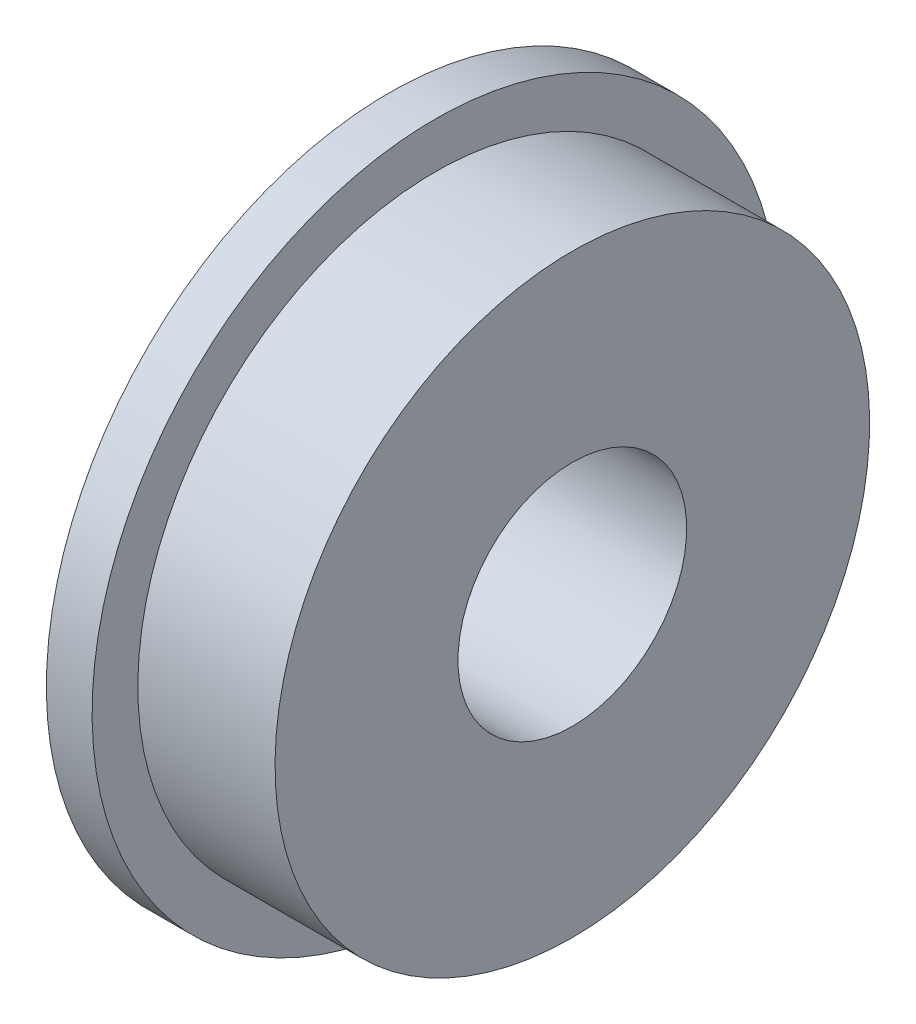
ISO-10303-21;
HEADER;
FILE_DESCRIPTION(('STEP AP214'),'2;1');
FILE_NAME('part.step','',(''),(''),'','','');
FILE_SCHEMA(('AUTOMOTIVE_DESIGN { 1 0 10303 214 1 1 1 1 }'));
ENDSEC;
DATA;
#1=APPLICATION_CONTEXT('core data for automotive mechanical design processes');
#2=APPLICATION_PROTOCOL_DEFINITION('international standard','automotive_design',2000,#1);
#3=PRODUCT_CONTEXT('',#1,'mechanical');
#4=PRODUCT('Part','Part','',(#3));
#5=PRODUCT_RELATED_PRODUCT_CATEGORY('part','',(#4));
#6=PRODUCT_DEFINITION_FORMATION('','',#4);
#7=PRODUCT_DEFINITION_CONTEXT('part definition',#1,'design');
#8=PRODUCT_DEFINITION('design','',#6,#7);
#9=PRODUCT_DEFINITION_SHAPE('','',#8);
#10=(LENGTH_UNIT() NAMED_UNIT(*) SI_UNIT(.MILLI.,.METRE.));
#11=(NAMED_UNIT(*) PLANE_ANGLE_UNIT() SI_UNIT($,.RADIAN.));
#12=(NAMED_UNIT(*) SI_UNIT($,.STERADIAN.) SOLID_ANGLE_UNIT());
#13=UNCERTAINTY_MEASURE_WITH_UNIT(LENGTH_MEASURE(1.E-05),#10,'distance_accuracy_value','');
#14=(GEOMETRIC_REPRESENTATION_CONTEXT(3) GLOBAL_UNCERTAINTY_ASSIGNED_CONTEXT((#13)) GLOBAL_UNIT_ASSIGNED_CONTEXT((#10,
#11,#12)) REPRESENTATION_CONTEXT('',''));
#15=CARTESIAN_POINT('',(0.,0.,0.));
#16=DIRECTION('',(0.,0.,1.));
#17=DIRECTION('',(1.,0.,0.));
#18=AXIS2_PLACEMENT_3D('',#15,#16,#17);
#19=CARTESIAN_POINT('',(103.485844045933,4.70340626519567E-11,0.));
#20=DIRECTION('',(-1.,-8.03141799010227E-13,0.));
#21=DIRECTION('',(8.03141799010227E-13,-1.,0.));
#22=AXIS2_PLACEMENT_3D('',#19,#20,#21);
#23=PLANE('',#22);
#24=CARTESIAN_POINT('',(103.485844045912,25.820853374661,0.));
#25=DIRECTION('',(-1.,-8.03141799010227E-13,0.));
#26=DIRECTION('',(8.03141799010227E-13,-1.,0.));
#27=AXIS2_PLACEMENT_3D('',#24,#25,#26);
#28=CIRCLE('',#27,6.49999999996922);
#29=CARTESIAN_POINT('',(103.485844045917,19.3208533746918,0.));
#30=VERTEX_POINT('',#29);
#31=EDGE_CURVE('E54',#30,#30,#28,.T.);
#32=ORIENTED_EDGE('',*,*,#31,.F.);
#33=EDGE_LOOP('',(#32));
#34=FACE_BOUND('',#33,.T.);
#35=CARTESIAN_POINT('',(103.485844045913,25.820853374661,0.));
#36=DIRECTION('',(-1.,-8.03141799010227E-13,0.));
#37=DIRECTION('',(8.03141799010227E-13,-1.,0.));
#38=AXIS2_PLACEMENT_3D('',#35,#36,#37);
#39=CIRCLE('',#38,2.49999999999833);
#40=CARTESIAN_POINT('',(103.485844045915,23.3208533746627,0.));
#41=VERTEX_POINT('',#40);
#42=EDGE_CURVE('E10',#41,#41,#39,.T.);
#43=ORIENTED_EDGE('',*,*,#42,.T.);
#44=EDGE_LOOP('',(#43));
#45=FACE_BOUND('',#44,.T.);
#46=ADVANCED_FACE('F32',(#34,#45),#23,.F.);
#47=CARTESIAN_POINT('',(69.3289403704308,25.8208533746336,0.));
#48=DIRECTION('',(-1.,-8.03141799010227E-13,0.));
#49=DIRECTION('',(8.03141799010227E-13,-1.,0.));
#50=AXIS2_PLACEMENT_3D('',#47,#48,#49);
#51=CYLINDRICAL_SURFACE('',#50,2.49999999999854);
#52=ORIENTED_EDGE('',*,*,#42,.F.);
#53=EDGE_LOOP('',(#52));
#54=FACE_BOUND('',#53,.T.);
#55=CARTESIAN_POINT('',(99.4858440459124,25.8208533746578,0.));
#56=DIRECTION('',(-1.,-8.03141799010227E-13,0.));
#57=DIRECTION('',(8.03141799010227E-13,-1.,0.));
#58=AXIS2_PLACEMENT_3D('',#55,#56,#57);
#59=CIRCLE('',#58,2.49999999999875);
#60=CARTESIAN_POINT('',(99.4858440459144,23.3208533746591,0.));
#61=VERTEX_POINT('',#60);
#62=EDGE_CURVE('E38',#61,#61,#59,.T.);
#63=ORIENTED_EDGE('',*,*,#62,.T.);
#64=EDGE_LOOP('',(#63));
#65=FACE_BOUND('',#64,.T.);
#66=ADVANCED_FACE('F62',(#54,#65),#51,.F.);
#67=CARTESIAN_POINT('',(99.4858440459311,0.,0.));
#68=DIRECTION('',(-1.,-8.03141799010227E-13,0.));
#69=DIRECTION('',(8.03141799010227E-13,-1.,0.));
#70=AXIS2_PLACEMENT_3D('',#67,#68,#69);
#71=PLANE('',#70);
#72=CARTESIAN_POINT('',(99.4858440459084,25.8208533746578,0.));
#73=DIRECTION('',(-1.,-8.03141799010227E-13,0.));
#74=DIRECTION('',(8.03141799010227E-13,-1.,0.));
#75=AXIS2_PLACEMENT_3D('',#72,#73,#74);
#76=CIRCLE('',#75,7.50000000009698);
#77=CARTESIAN_POINT('',(99.4858440459144,18.3208533745608,0.));
#78=VERTEX_POINT('',#77);
#79=EDGE_CURVE('E42',#78,#78,#76,.T.);
#80=ORIENTED_EDGE('',*,*,#79,.T.);
#81=EDGE_LOOP('',(#80));
#82=FACE_BOUND('',#81,.T.);
#83=ORIENTED_EDGE('',*,*,#62,.F.);
#84=EDGE_LOOP('',(#83));
#85=FACE_BOUND('',#84,.T.);
#86=ADVANCED_FACE('F66',(#82,#85),#71,.T.);
#87=CARTESIAN_POINT('',(69.3289403704308,25.8208533746336,0.));
#88=DIRECTION('',(-1.,-8.03141799010227E-13,0.));
#89=DIRECTION('',(8.03141799010227E-13,-1.,0.));
#90=AXIS2_PLACEMENT_3D('',#87,#88,#89);
#91=CYLINDRICAL_SURFACE('',#90,7.50000000009738);
#92=CARTESIAN_POINT('',(100.485844045909,25.8208533746586,0.));
#93=DIRECTION('',(-1.,-8.03141799010227E-13,0.));
#94=DIRECTION('',(8.03141799010227E-13,-1.,0.));
#95=AXIS2_PLACEMENT_3D('',#92,#93,#94);
#96=CIRCLE('',#95,7.50000000009778);
#97=CARTESIAN_POINT('',(100.485844045915,18.3208533745608,0.));
#98=VERTEX_POINT('',#97);
#99=EDGE_CURVE('E46',#98,#98,#96,.T.);
#100=ORIENTED_EDGE('',*,*,#99,.T.);
#101=EDGE_LOOP('',(#100));
#102=FACE_BOUND('',#101,.T.);
#103=ORIENTED_EDGE('',*,*,#79,.F.);
#104=EDGE_LOOP('',(#103));
#105=FACE_BOUND('',#104,.T.);
#106=ADVANCED_FACE('F71',(#102,#105),#91,.T.);
#107=CARTESIAN_POINT('',(100.48584404593,0.,0.));
#108=DIRECTION('',(-1.,-8.03141799010227E-13,0.));
#109=DIRECTION('',(8.03141799010227E-13,-1.,0.));
#110=AXIS2_PLACEMENT_3D('',#107,#108,#109);
#111=PLANE('',#110);
#112=ORIENTED_EDGE('',*,*,#99,.F.);
#113=EDGE_LOOP('',(#112));
#114=FACE_BOUND('',#113,.T.);
#115=CARTESIAN_POINT('',(100.48584404591,25.8208533746586,0.));
#116=DIRECTION('',(-1.,-8.03141799010227E-13,0.));
#117=DIRECTION('',(8.03141799010227E-13,-1.,0.));
#118=AXIS2_PLACEMENT_3D('',#115,#116,#117);
#119=CIRCLE('',#118,6.49999999988314);
#120=CARTESIAN_POINT('',(100.485844045915,19.3208533747755,0.));
#121=VERTEX_POINT('',#120);
#122=EDGE_CURVE('E51',#121,#121,#119,.T.);
#123=ORIENTED_EDGE('',*,*,#122,.T.);
#124=EDGE_LOOP('',(#123));
#125=FACE_BOUND('',#124,.T.);
#126=ADVANCED_FACE('F77',(#114,#125),#111,.F.);
#127=CARTESIAN_POINT('',(69.3289403704308,25.8208533746336,0.));
#128=DIRECTION('',(-1.,-8.03141799010227E-13,0.));
#129=DIRECTION('',(8.03141799010227E-13,-1.,0.));
#130=AXIS2_PLACEMENT_3D('',#127,#128,#129);
#131=CYLINDRICAL_SURFACE('',#130,6.49999999992618);
#132=ORIENTED_EDGE('',*,*,#31,.T.);
#133=EDGE_LOOP('',(#132));
#134=FACE_BOUND('',#133,.T.);
#135=ORIENTED_EDGE('',*,*,#122,.F.);
#136=EDGE_LOOP('',(#135));
#137=FACE_BOUND('',#136,.T.);
#138=ADVANCED_FACE('F58',(#134,#137),#131,.T.);
#139=CLOSED_SHELL('',(#46,#66,#86,#106,#126,#138));
#140=MANIFOLD_SOLID_BREP('B2',#139);
#141=ADVANCED_BREP_SHAPE_REPRESENTATION('',(#18,#140),#14);
#142=SHAPE_DEFINITION_REPRESENTATION(#9,#141);
ENDSEC;
END-ISO-10303-21;
